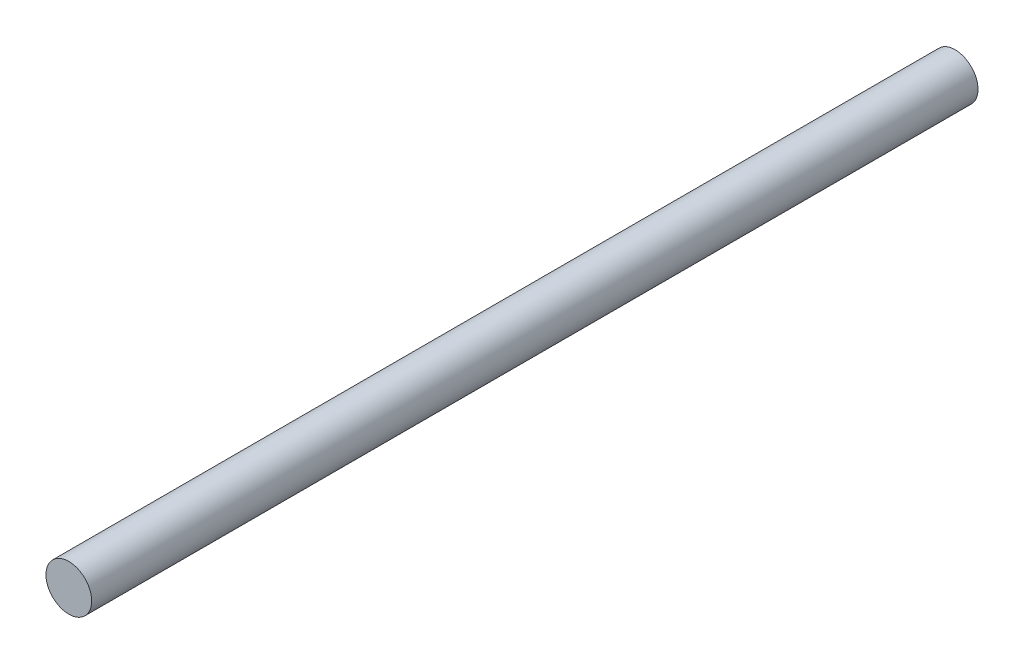
ISO-10303-21;
HEADER;
FILE_DESCRIPTION(('STEP AP214'),'2;1');
FILE_NAME('part.step','',(''),(''),'','','');
FILE_SCHEMA(('AUTOMOTIVE_DESIGN { 1 0 10303 214 1 1 1 1 }'));
ENDSEC;
DATA;
#1=APPLICATION_CONTEXT('core data for automotive mechanical design processes');
#2=APPLICATION_PROTOCOL_DEFINITION('international standard','automotive_design',2000,#1);
#3=PRODUCT_CONTEXT('',#1,'mechanical');
#4=PRODUCT('Part','Part','',(#3));
#5=PRODUCT_RELATED_PRODUCT_CATEGORY('part','',(#4));
#6=PRODUCT_DEFINITION_FORMATION('','',#4);
#7=PRODUCT_DEFINITION_CONTEXT('part definition',#1,'design');
#8=PRODUCT_DEFINITION('design','',#6,#7);
#9=PRODUCT_DEFINITION_SHAPE('','',#8);
#10=(LENGTH_UNIT() NAMED_UNIT(*) SI_UNIT(.MILLI.,.METRE.));
#11=(NAMED_UNIT(*) PLANE_ANGLE_UNIT() SI_UNIT($,.RADIAN.));
#12=(NAMED_UNIT(*) SI_UNIT($,.STERADIAN.) SOLID_ANGLE_UNIT());
#13=UNCERTAINTY_MEASURE_WITH_UNIT(LENGTH_MEASURE(1.E-05),#10,'distance_accuracy_value','');
#14=(GEOMETRIC_REPRESENTATION_CONTEXT(3) GLOBAL_UNCERTAINTY_ASSIGNED_CONTEXT((#13)) GLOBAL_UNIT_ASSIGNED_CONTEXT((#10,
#11,#12)) REPRESENTATION_CONTEXT('',''));
#15=CARTESIAN_POINT('',(0.,0.,0.));
#16=DIRECTION('',(0.,0.,1.));
#17=DIRECTION('',(1.,0.,0.));
#18=AXIS2_PLACEMENT_3D('',#15,#16,#17);
#19=CARTESIAN_POINT('',(0.,0.,153.15));
#20=DIRECTION('',(0.,0.,-1.));
#21=DIRECTION('',(-1.,0.,0.));
#22=AXIS2_PLACEMENT_3D('',#19,#20,#21);
#23=CYLINDRICAL_SURFACE('',#22,3.95);
#24=CARTESIAN_POINT('',(0.,0.,153.15));
#25=DIRECTION('',(0.,0.,1.));
#26=DIRECTION('',(1.,0.,0.));
#27=AXIS2_PLACEMENT_3D('',#24,#25,#26);
#28=CIRCLE('',#27,3.95);
#29=CARTESIAN_POINT('',(3.95,0.,153.15));
#30=VERTEX_POINT('',#29);
#31=EDGE_CURVE('E10',#30,#30,#28,.T.);
#32=ORIENTED_EDGE('',*,*,#31,.F.);
#33=EDGE_LOOP('',(#32));
#34=FACE_BOUND('',#33,.T.);
#35=CARTESIAN_POINT('',(0.,0.,0.));
#36=DIRECTION('',(0.,0.,1.));
#37=DIRECTION('',(1.,0.,0.));
#38=AXIS2_PLACEMENT_3D('',#35,#36,#37);
#39=CIRCLE('',#38,3.95);
#40=CARTESIAN_POINT('',(3.95,0.,0.));
#41=VERTEX_POINT('',#40);
#42=EDGE_CURVE('E36',#41,#41,#39,.T.);
#43=ORIENTED_EDGE('',*,*,#42,.T.);
#44=EDGE_LOOP('',(#43));
#45=FACE_BOUND('',#44,.T.);
#46=ADVANCED_FACE('F33',(#34,#45),#23,.T.);
#47=CARTESIAN_POINT('',(0.,0.,153.15));
#48=DIRECTION('',(0.,0.,1.));
#49=DIRECTION('',(1.,0.,0.));
#50=AXIS2_PLACEMENT_3D('',#47,#48,#49);
#51=PLANE('',#50);
#52=ORIENTED_EDGE('',*,*,#31,.T.);
#53=EDGE_LOOP('',(#52));
#54=FACE_BOUND('',#53,.T.);
#55=ADVANCED_FACE('F48',(#54),#51,.T.);
#56=CARTESIAN_POINT('',(0.,0.,0.));
#57=DIRECTION('',(0.,0.,1.));
#58=DIRECTION('',(1.,0.,0.));
#59=AXIS2_PLACEMENT_3D('',#56,#57,#58);
#60=PLANE('',#59);
#61=ORIENTED_EDGE('',*,*,#42,.F.);
#62=EDGE_LOOP('',(#61));
#63=FACE_BOUND('',#62,.T.);
#64=ADVANCED_FACE('F46',(#63),#60,.F.);
#65=CLOSED_SHELL('',(#46,#55,#64));
#66=MANIFOLD_SOLID_BREP('B2',#65);
#67=ADVANCED_BREP_SHAPE_REPRESENTATION('',(#18,#66),#14);
#68=SHAPE_DEFINITION_REPRESENTATION(#9,#67);
ENDSEC;
END-ISO-10303-21;
